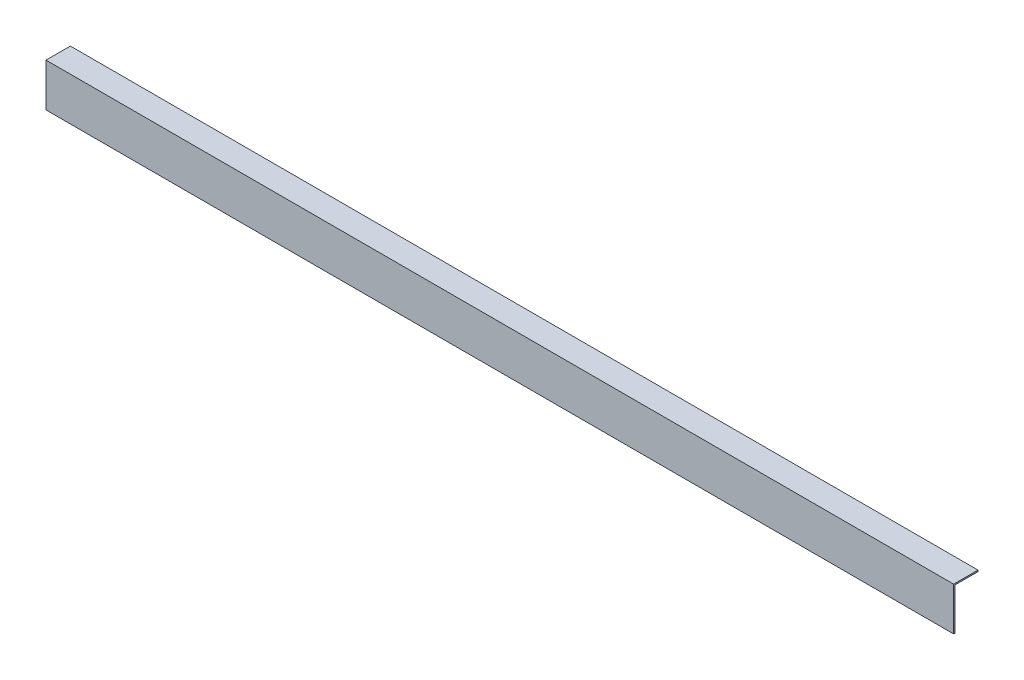
ISO-10303-21;
HEADER;
FILE_DESCRIPTION(('STEP AP214'),'2;1');
FILE_NAME('part.step','',(''),(''),'','','');
FILE_SCHEMA(('AUTOMOTIVE_DESIGN { 1 0 10303 214 1 1 1 1 }'));
ENDSEC;
DATA;
#1=APPLICATION_CONTEXT('core data for automotive mechanical design processes');
#2=APPLICATION_PROTOCOL_DEFINITION('international standard','automotive_design',2000,#1);
#3=PRODUCT_CONTEXT('',#1,'mechanical');
#4=PRODUCT('Part','Part','',(#3));
#5=PRODUCT_RELATED_PRODUCT_CATEGORY('part','',(#4));
#6=PRODUCT_DEFINITION_FORMATION('','',#4);
#7=PRODUCT_DEFINITION_CONTEXT('part definition',#1,'design');
#8=PRODUCT_DEFINITION('design','',#6,#7);
#9=PRODUCT_DEFINITION_SHAPE('','',#8);
#10=(LENGTH_UNIT() NAMED_UNIT(*) SI_UNIT(.MILLI.,.METRE.));
#11=(NAMED_UNIT(*) PLANE_ANGLE_UNIT() SI_UNIT($,.RADIAN.));
#12=(NAMED_UNIT(*) SI_UNIT($,.STERADIAN.) SOLID_ANGLE_UNIT());
#13=UNCERTAINTY_MEASURE_WITH_UNIT(LENGTH_MEASURE(1.E-05),#10,'distance_accuracy_value','');
#14=(GEOMETRIC_REPRESENTATION_CONTEXT(3) GLOBAL_UNCERTAINTY_ASSIGNED_CONTEXT((#13)) GLOBAL_UNIT_ASSIGNED_CONTEXT((#10,
#11,#12)) REPRESENTATION_CONTEXT('',''));
#15=CARTESIAN_POINT('',(0.,0.,0.));
#16=DIRECTION('',(0.,0.,1.));
#17=DIRECTION('',(1.,0.,0.));
#18=AXIS2_PLACEMENT_3D('',#15,#16,#17);
#19=CARTESIAN_POINT('',(687.,-849.,2053.));
#20=DIRECTION('',(-1.,0.,0.));
#21=DIRECTION('',(0.,-1.,0.));
#22=AXIS2_PLACEMENT_3D('',#19,#20,#21);
#23=PLANE('',#22);
#24=DIRECTION('',(0.,0.,1.));
#25=VECTOR('',#24,1.);
#26=CARTESIAN_POINT('',(687.,-911.,2086.));
#27=LINE('',#26,#25);
#28=CARTESIAN_POINT('',(687.,-911.,2086.));
#29=VERTEX_POINT('',#28);
#30=CARTESIAN_POINT('',(687.,-911.,2088.));
#31=VERTEX_POINT('',#30);
#32=EDGE_CURVE('E88',#29,#31,#27,.T.);
#33=ORIENTED_EDGE('',*,*,#32,.F.);
#34=DIRECTION('',(0.,-1.,0.));
#35=VECTOR('',#34,1.);
#36=CARTESIAN_POINT('',(687.,-851.,2086.));
#37=LINE('',#36,#35);
#38=CARTESIAN_POINT('',(687.,-851.,2086.));
#39=VERTEX_POINT('',#38);
#40=EDGE_CURVE('E35',#39,#29,#37,.T.);
#41=ORIENTED_EDGE('',*,*,#40,.F.);
#42=DIRECTION('',(0.,0.,1.));
#43=VECTOR('',#42,1.);
#44=CARTESIAN_POINT('',(687.,-851.,2053.));
#45=LINE('',#44,#43);
#46=CARTESIAN_POINT('',(687.,-851.,2053.));
#47=VERTEX_POINT('',#46);
#48=EDGE_CURVE('E109',#47,#39,#45,.T.);
#49=ORIENTED_EDGE('',*,*,#48,.F.);
#50=DIRECTION('',(0.,-1.,0.));
#51=VECTOR('',#50,1.);
#52=CARTESIAN_POINT('',(687.,-849.,2053.));
#53=LINE('',#52,#51);
#54=CARTESIAN_POINT('',(687.,-849.,2053.));
#55=VERTEX_POINT('',#54);
#56=EDGE_CURVE('E20',#55,#47,#53,.T.);
#57=ORIENTED_EDGE('',*,*,#56,.F.);
#58=DIRECTION('',(0.,0.,-1.));
#59=VECTOR('',#58,1.);
#60=CARTESIAN_POINT('',(687.,-849.,2088.));
#61=LINE('',#60,#59);
#62=CARTESIAN_POINT('',(687.,-849.,2088.));
#63=VERTEX_POINT('',#62);
#64=EDGE_CURVE('E76',#63,#55,#61,.T.);
#65=ORIENTED_EDGE('',*,*,#64,.F.);
#66=DIRECTION('',(0.,1.,0.));
#67=VECTOR('',#66,1.);
#68=CARTESIAN_POINT('',(687.,-911.,2088.));
#69=LINE('',#68,#67);
#70=EDGE_CURVE('E26',#31,#63,#69,.T.);
#71=ORIENTED_EDGE('',*,*,#70,.F.);
#72=EDGE_LOOP('',(#33,#41,#49,#57,#65,#71));
#73=FACE_BOUND('',#72,.T.);
#74=ADVANCED_FACE('F17',(#73),#23,.F.);
#75=CARTESIAN_POINT('',(687.,-911.,2088.));
#76=DIRECTION('',(0.,0.,1.));
#77=DIRECTION('',(0.,-1.,0.));
#78=AXIS2_PLACEMENT_3D('',#75,#76,#77);
#79=PLANE('',#78);
#80=DIRECTION('',(-1.,0.,0.));
#81=VECTOR('',#80,1.);
#82=CARTESIAN_POINT('',(687.,-849.,2088.));
#83=LINE('',#82,#81);
#84=CARTESIAN_POINT('',(-617.,-849.,2088.));
#85=VERTEX_POINT('',#84);
#86=EDGE_CURVE('E11',#63,#85,#83,.T.);
#87=ORIENTED_EDGE('',*,*,#86,.T.);
#88=DIRECTION('',(0.,1.,0.));
#89=VECTOR('',#88,1.);
#90=CARTESIAN_POINT('',(-617.,-911.,2088.));
#91=LINE('',#90,#89);
#92=CARTESIAN_POINT('',(-617.,-911.,2088.));
#93=VERTEX_POINT('',#92);
#94=EDGE_CURVE('E96',#93,#85,#91,.T.);
#95=ORIENTED_EDGE('',*,*,#94,.F.);
#96=DIRECTION('',(-1.,0.,0.));
#97=VECTOR('',#96,1.);
#98=CARTESIAN_POINT('',(687.,-911.,2088.));
#99=LINE('',#98,#97);
#100=EDGE_CURVE('E87',#31,#93,#99,.T.);
#101=ORIENTED_EDGE('',*,*,#100,.F.);
#102=ORIENTED_EDGE('',*,*,#70,.T.);
#103=EDGE_LOOP('',(#87,#95,#101,#102));
#104=FACE_BOUND('',#103,.T.);
#105=ADVANCED_FACE('F84',(#104),#79,.T.);
#106=CARTESIAN_POINT('',(687.,-911.,2086.));
#107=DIRECTION('',(0.,-1.,0.));
#108=DIRECTION('',(0.,0.,1.));
#109=AXIS2_PLACEMENT_3D('',#106,#107,#108);
#110=PLANE('',#109);
#111=ORIENTED_EDGE('',*,*,#32,.T.);
#112=ORIENTED_EDGE('',*,*,#100,.T.);
#113=DIRECTION('',(0.,0.,1.));
#114=VECTOR('',#113,1.);
#115=CARTESIAN_POINT('',(-617.,-911.,2053.));
#116=LINE('',#115,#114);
#117=CARTESIAN_POINT('',(-617.,-911.,2053.));
#118=VERTEX_POINT('',#117);
#119=EDGE_CURVE('E101',#118,#93,#116,.T.);
#120=ORIENTED_EDGE('',*,*,#119,.F.);
#121=DIRECTION('',(1.,0.,0.));
#122=VECTOR('',#121,1.);
#123=CARTESIAN_POINT('',(-617.,-911.,2053.));
#124=LINE('',#123,#122);
#125=CARTESIAN_POINT('',(-615.,-911.,2053.));
#126=VERTEX_POINT('',#125);
#127=EDGE_CURVE('E125',#118,#126,#124,.T.);
#128=ORIENTED_EDGE('',*,*,#127,.T.);
#129=DIRECTION('',(0.,0.,1.));
#130=VECTOR('',#129,1.);
#131=CARTESIAN_POINT('',(-615.,-911.,2053.));
#132=LINE('',#131,#130);
#133=CARTESIAN_POINT('',(-615.,-911.,2086.));
#134=VERTEX_POINT('',#133);
#135=EDGE_CURVE('E115',#126,#134,#132,.T.);
#136=ORIENTED_EDGE('',*,*,#135,.T.);
#137=DIRECTION('',(-1.,0.,0.));
#138=VECTOR('',#137,1.);
#139=CARTESIAN_POINT('',(687.,-911.,2086.));
#140=LINE('',#139,#138);
#141=EDGE_CURVE('E113',#29,#134,#140,.T.);
#142=ORIENTED_EDGE('',*,*,#141,.F.);
#143=EDGE_LOOP('',(#111,#112,#120,#128,#136,#142));
#144=FACE_BOUND('',#143,.T.);
#145=ADVANCED_FACE('F132',(#144),#110,.T.);
#146=CARTESIAN_POINT('',(687.,-851.,2086.));
#147=DIRECTION('',(0.,0.,-1.));
#148=DIRECTION('',(1.,0.,0.));
#149=AXIS2_PLACEMENT_3D('',#146,#147,#148);
#150=PLANE('',#149);
#151=DIRECTION('',(-1.,0.,0.));
#152=VECTOR('',#151,1.);
#153=CARTESIAN_POINT('',(687.,-851.,2086.));
#154=LINE('',#153,#152);
#155=CARTESIAN_POINT('',(-615.,-851.,2086.));
#156=VERTEX_POINT('',#155);
#157=EDGE_CURVE('E104',#39,#156,#154,.T.);
#158=ORIENTED_EDGE('',*,*,#157,.F.);
#159=ORIENTED_EDGE('',*,*,#40,.T.);
#160=ORIENTED_EDGE('',*,*,#141,.T.);
#161=DIRECTION('',(0.,-1.,0.));
#162=VECTOR('',#161,1.);
#163=CARTESIAN_POINT('',(-615.,-851.,2086.));
#164=LINE('',#163,#162);
#165=EDGE_CURVE('E108',#156,#134,#164,.T.);
#166=ORIENTED_EDGE('',*,*,#165,.F.);
#167=EDGE_LOOP('',(#158,#159,#160,#166));
#168=FACE_BOUND('',#167,.T.);
#169=ADVANCED_FACE('F140',(#168),#150,.T.);
#170=CARTESIAN_POINT('',(-615.,-849.,2053.));
#171=DIRECTION('',(-1.,0.,0.));
#172=DIRECTION('',(0.,-1.,0.));
#173=AXIS2_PLACEMENT_3D('',#170,#171,#172);
#174=PLANE('',#173);
#175=ORIENTED_EDGE('',*,*,#165,.T.);
#176=ORIENTED_EDGE('',*,*,#135,.F.);
#177=DIRECTION('',(0.,-1.,0.));
#178=VECTOR('',#177,1.);
#179=CARTESIAN_POINT('',(-615.,-851.,2053.));
#180=LINE('',#179,#178);
#181=CARTESIAN_POINT('',(-615.,-851.,2053.));
#182=VERTEX_POINT('',#181);
#183=EDGE_CURVE('E99',#182,#126,#180,.T.);
#184=ORIENTED_EDGE('',*,*,#183,.F.);
#185=DIRECTION('',(0.,0.,1.));
#186=VECTOR('',#185,1.);
#187=CARTESIAN_POINT('',(-615.,-851.,2053.));
#188=LINE('',#187,#186);
#189=EDGE_CURVE('E106',#182,#156,#188,.T.);
#190=ORIENTED_EDGE('',*,*,#189,.T.);
#191=EDGE_LOOP('',(#175,#176,#184,#190));
#192=FACE_BOUND('',#191,.T.);
#193=ADVANCED_FACE('F138',(#192),#174,.F.);
#194=CARTESIAN_POINT('',(687.,-851.,2053.));
#195=DIRECTION('',(0.,-1.,0.));
#196=DIRECTION('',(0.,0.,1.));
#197=AXIS2_PLACEMENT_3D('',#194,#195,#196);
#198=PLANE('',#197);
#199=DIRECTION('',(-1.,0.,0.));
#200=VECTOR('',#199,1.);
#201=CARTESIAN_POINT('',(687.,-851.,2053.));
#202=LINE('',#201,#200);
#203=EDGE_CURVE('E121',#47,#182,#202,.T.);
#204=ORIENTED_EDGE('',*,*,#203,.F.);
#205=ORIENTED_EDGE('',*,*,#48,.T.);
#206=ORIENTED_EDGE('',*,*,#157,.T.);
#207=ORIENTED_EDGE('',*,*,#189,.F.);
#208=EDGE_LOOP('',(#204,#205,#206,#207));
#209=FACE_BOUND('',#208,.T.);
#210=ADVANCED_FACE('F143',(#209),#198,.T.);
#211=CARTESIAN_POINT('',(687.,-849.,2053.));
#212=DIRECTION('',(0.,0.,-1.));
#213=DIRECTION('',(1.,0.,0.));
#214=AXIS2_PLACEMENT_3D('',#211,#212,#213);
#215=PLANE('',#214);
#216=DIRECTION('',(-1.,0.,0.));
#217=VECTOR('',#216,1.);
#218=CARTESIAN_POINT('',(687.,-849.,2053.));
#219=LINE('',#218,#217);
#220=CARTESIAN_POINT('',(-617.,-849.,2053.));
#221=VERTEX_POINT('',#220);
#222=EDGE_CURVE('E81',#55,#221,#219,.T.);
#223=ORIENTED_EDGE('',*,*,#222,.F.);
#224=ORIENTED_EDGE('',*,*,#56,.T.);
#225=ORIENTED_EDGE('',*,*,#203,.T.);
#226=ORIENTED_EDGE('',*,*,#183,.T.);
#227=ORIENTED_EDGE('',*,*,#127,.F.);
#228=DIRECTION('',(0.,-1.,0.));
#229=VECTOR('',#228,1.);
#230=CARTESIAN_POINT('',(-617.,-849.,2053.));
#231=LINE('',#230,#229);
#232=EDGE_CURVE('E97',#221,#118,#231,.T.);
#233=ORIENTED_EDGE('',*,*,#232,.F.);
#234=EDGE_LOOP('',(#223,#224,#225,#226,#227,#233));
#235=FACE_BOUND('',#234,.T.);
#236=ADVANCED_FACE('F145',(#235),#215,.T.);
#237=CARTESIAN_POINT('',(-617.,-849.,2053.));
#238=DIRECTION('',(-1.,0.,0.));
#239=DIRECTION('',(0.,-1.,0.));
#240=AXIS2_PLACEMENT_3D('',#237,#238,#239);
#241=PLANE('',#240);
#242=ORIENTED_EDGE('',*,*,#94,.T.);
#243=DIRECTION('',(0.,0.,-1.));
#244=VECTOR('',#243,1.);
#245=CARTESIAN_POINT('',(-617.,-849.,2088.));
#246=LINE('',#245,#244);
#247=EDGE_CURVE('E92',#85,#221,#246,.T.);
#248=ORIENTED_EDGE('',*,*,#247,.T.);
#249=ORIENTED_EDGE('',*,*,#232,.T.);
#250=ORIENTED_EDGE('',*,*,#119,.T.);
#251=EDGE_LOOP('',(#242,#248,#249,#250));
#252=FACE_BOUND('',#251,.T.);
#253=ADVANCED_FACE('F144',(#252),#241,.T.);
#254=CARTESIAN_POINT('',(687.,-849.,2088.));
#255=DIRECTION('',(0.,1.,0.));
#256=DIRECTION('',(-1.,0.,0.));
#257=AXIS2_PLACEMENT_3D('',#254,#255,#256);
#258=PLANE('',#257);
#259=ORIENTED_EDGE('',*,*,#222,.T.);
#260=ORIENTED_EDGE('',*,*,#247,.F.);
#261=ORIENTED_EDGE('',*,*,#86,.F.);
#262=ORIENTED_EDGE('',*,*,#64,.T.);
#263=EDGE_LOOP('',(#259,#260,#261,#262));
#264=FACE_BOUND('',#263,.T.);
#265=ADVANCED_FACE('F90',(#264),#258,.T.);
#266=CLOSED_SHELL('',(#74,#105,#145,#169,#193,#210,#236,#253,#265));
#267=MANIFOLD_SOLID_BREP('B1',#266);
#268=ADVANCED_BREP_SHAPE_REPRESENTATION('',(#18,#267),#14);
#269=SHAPE_DEFINITION_REPRESENTATION(#9,#268);
ENDSEC;
END-ISO-10303-21;
